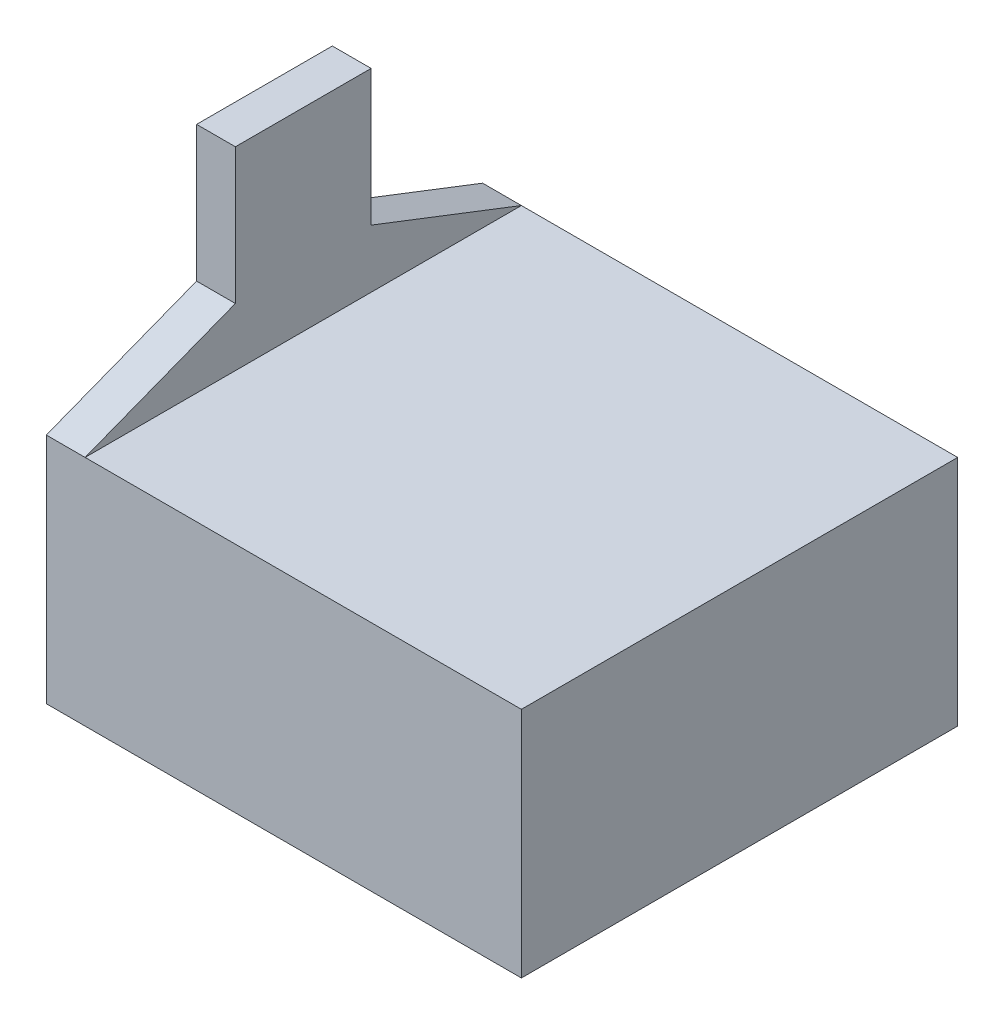
ISO-10303-21;
HEADER;
FILE_DESCRIPTION(('STEP AP214'),'2;1');
FILE_NAME('part.step','',(''),(''),'','','');
FILE_SCHEMA(('AUTOMOTIVE_DESIGN { 1 0 10303 214 1 1 1 1 }'));
ENDSEC;
DATA;
#1=APPLICATION_CONTEXT('core data for automotive mechanical design processes');
#2=APPLICATION_PROTOCOL_DEFINITION('international standard','automotive_design',2000,#1);
#3=PRODUCT_CONTEXT('',#1,'mechanical');
#4=PRODUCT('Part','Part','',(#3));
#5=PRODUCT_RELATED_PRODUCT_CATEGORY('part','',(#4));
#6=PRODUCT_DEFINITION_FORMATION('','',#4);
#7=PRODUCT_DEFINITION_CONTEXT('part definition',#1,'design');
#8=PRODUCT_DEFINITION('design','',#6,#7);
#9=PRODUCT_DEFINITION_SHAPE('','',#8);
#10=(LENGTH_UNIT() NAMED_UNIT(*) SI_UNIT(.MILLI.,.METRE.));
#11=(NAMED_UNIT(*) PLANE_ANGLE_UNIT() SI_UNIT($,.RADIAN.));
#12=(NAMED_UNIT(*) SI_UNIT($,.STERADIAN.) SOLID_ANGLE_UNIT());
#13=UNCERTAINTY_MEASURE_WITH_UNIT(LENGTH_MEASURE(1.E-05),#10,'distance_accuracy_value','');
#14=(GEOMETRIC_REPRESENTATION_CONTEXT(3) GLOBAL_UNCERTAINTY_ASSIGNED_CONTEXT((#13)) GLOBAL_UNIT_ASSIGNED_CONTEXT((#10,
#11,#12)) REPRESENTATION_CONTEXT('',''));
#15=CARTESIAN_POINT('',(0.,0.,0.));
#16=DIRECTION('',(0.,0.,1.));
#17=DIRECTION('',(1.,0.,0.));
#18=AXIS2_PLACEMENT_3D('',#15,#16,#17);
#19=CARTESIAN_POINT('',(2.,0.,0.));
#20=DIRECTION('',(1.,0.,0.));
#21=DIRECTION('',(0.,0.,-1.));
#22=AXIS2_PLACEMENT_3D('',#19,#20,#21);
#23=PLANE('',#22);
#24=DIRECTION('',(0.,-0.360994102557712,0.93256809827409));
#25=VECTOR('',#24,1.);
#26=CARTESIAN_POINT('',(2.,15.,3.5));
#27=LINE('',#26,#25);
#28=CARTESIAN_POINT('',(2.,15.,3.5));
#29=VERTEX_POINT('',#28);
#30=CARTESIAN_POINT('',(2.,12.,11.25));
#31=VERTEX_POINT('',#30);
#32=EDGE_CURVE('E127',#29,#31,#27,.T.);
#33=ORIENTED_EDGE('',*,*,#32,.T.);
#34=DIRECTION('',(0.,0.,-1.));
#35=VECTOR('',#34,1.);
#36=CARTESIAN_POINT('',(2.,12.,11.25));
#37=LINE('',#36,#35);
#38=CARTESIAN_POINT('',(2.,12.,-11.25));
#39=VERTEX_POINT('',#38);
#40=EDGE_CURVE('E186',#31,#39,#37,.T.);
#41=ORIENTED_EDGE('',*,*,#40,.T.);
#42=DIRECTION('',(0.,0.360994102557712,0.93256809827409));
#43=VECTOR('',#42,1.);
#44=CARTESIAN_POINT('',(2.,12.,-11.25));
#45=LINE('',#44,#43);
#46=CARTESIAN_POINT('',(2.,15.,-3.5));
#47=VERTEX_POINT('',#46);
#48=EDGE_CURVE('E110',#39,#47,#45,.T.);
#49=ORIENTED_EDGE('',*,*,#48,.T.);
#50=DIRECTION('',(0.,1.,0.));
#51=VECTOR('',#50,1.);
#52=CARTESIAN_POINT('',(2.,15.,-3.5));
#53=LINE('',#52,#51);
#54=CARTESIAN_POINT('',(2.,22.,-3.5));
#55=VERTEX_POINT('',#54);
#56=EDGE_CURVE('E104',#47,#55,#53,.T.);
#57=ORIENTED_EDGE('',*,*,#56,.T.);
#58=DIRECTION('',(0.,0.,1.));
#59=VECTOR('',#58,1.);
#60=CARTESIAN_POINT('',(2.,22.,-3.5));
#61=LINE('',#60,#59);
#62=CARTESIAN_POINT('',(2.,22.,3.5));
#63=VERTEX_POINT('',#62);
#64=EDGE_CURVE('E107',#55,#63,#61,.T.);
#65=ORIENTED_EDGE('',*,*,#64,.T.);
#66=DIRECTION('',(0.,-1.,0.));
#67=VECTOR('',#66,1.);
#68=CARTESIAN_POINT('',(2.,22.,3.5));
#69=LINE('',#68,#67);
#70=EDGE_CURVE('E50',#63,#29,#69,.T.);
#71=ORIENTED_EDGE('',*,*,#70,.T.);
#72=EDGE_LOOP('',(#33,#41,#49,#57,#65,#71));
#73=FACE_BOUND('',#72,.T.);
#74=ADVANCED_FACE('F33',(#73),#23,.T.);
#75=CARTESIAN_POINT('',(2.,12.,11.25));
#76=DIRECTION('',(0.,0.,-1.));
#77=DIRECTION('',(0.,1.,0.));
#78=AXIS2_PLACEMENT_3D('',#75,#76,#77);
#79=PLANE('',#78);
#80=DIRECTION('',(0.,-1.,0.));
#81=VECTOR('',#80,1.);
#82=CARTESIAN_POINT('',(0.,12.,11.25));
#83=LINE('',#82,#81);
#84=CARTESIAN_POINT('',(0.,12.,11.25));
#85=VERTEX_POINT('',#84);
#86=CARTESIAN_POINT('',(0.,0.,11.25));
#87=VERTEX_POINT('',#86);
#88=EDGE_CURVE('E133',#85,#87,#83,.T.);
#89=ORIENTED_EDGE('',*,*,#88,.T.);
#90=DIRECTION('',(-1.,0.,0.));
#91=VECTOR('',#90,1.);
#92=CARTESIAN_POINT('',(2.,0.,11.25));
#93=LINE('',#92,#91);
#94=CARTESIAN_POINT('',(24.5,0.,11.25));
#95=VERTEX_POINT('',#94);
#96=EDGE_CURVE('E11',#95,#87,#93,.T.);
#97=ORIENTED_EDGE('',*,*,#96,.F.);
#98=DIRECTION('',(0.,1.,0.));
#99=VECTOR('',#98,1.);
#100=CARTESIAN_POINT('',(24.5,0.,11.25));
#101=LINE('',#100,#99);
#102=CARTESIAN_POINT('',(24.5,12.,11.25));
#103=VERTEX_POINT('',#102);
#104=EDGE_CURVE('E176',#95,#103,#101,.T.);
#105=ORIENTED_EDGE('',*,*,#104,.T.);
#106=DIRECTION('',(-1.,0.,0.));
#107=VECTOR('',#106,1.);
#108=CARTESIAN_POINT('',(24.5,12.,11.25));
#109=LINE('',#108,#107);
#110=EDGE_CURVE('E137',#103,#31,#109,.T.);
#111=ORIENTED_EDGE('',*,*,#110,.T.);
#112=DIRECTION('',(-1.,0.,0.));
#113=VECTOR('',#112,1.);
#114=CARTESIAN_POINT('',(2.,12.,11.25));
#115=LINE('',#114,#113);
#116=EDGE_CURVE('E132',#31,#85,#115,.T.);
#117=ORIENTED_EDGE('',*,*,#116,.T.);
#118=EDGE_LOOP('',(#89,#97,#105,#111,#117));
#119=FACE_BOUND('',#118,.T.);
#120=ADVANCED_FACE('F35',(#119),#79,.F.);
#121=CARTESIAN_POINT('',(2.,0.,11.25));
#122=DIRECTION('',(0.,1.,0.));
#123=DIRECTION('',(0.,0.,1.));
#124=AXIS2_PLACEMENT_3D('',#121,#122,#123);
#125=PLANE('',#124);
#126=DIRECTION('',(0.,0.,-1.));
#127=VECTOR('',#126,1.);
#128=CARTESIAN_POINT('',(0.,0.,11.25));
#129=LINE('',#128,#127);
#130=CARTESIAN_POINT('',(0.,0.,-11.25));
#131=VERTEX_POINT('',#130);
#132=EDGE_CURVE('E136',#87,#131,#129,.T.);
#133=ORIENTED_EDGE('',*,*,#132,.T.);
#134=DIRECTION('',(-1.,0.,0.));
#135=VECTOR('',#134,1.);
#136=CARTESIAN_POINT('',(2.,0.,-11.25));
#137=LINE('',#136,#135);
#138=CARTESIAN_POINT('',(24.5,0.,-11.25));
#139=VERTEX_POINT('',#138);
#140=EDGE_CURVE('E42',#139,#131,#137,.T.);
#141=ORIENTED_EDGE('',*,*,#140,.F.);
#142=DIRECTION('',(0.,0.,-1.));
#143=VECTOR('',#142,1.);
#144=CARTESIAN_POINT('',(24.5,0.,11.25));
#145=LINE('',#144,#143);
#146=EDGE_CURVE('E188',#95,#139,#145,.T.);
#147=ORIENTED_EDGE('',*,*,#146,.F.);
#148=ORIENTED_EDGE('',*,*,#96,.T.);
#149=EDGE_LOOP('',(#133,#141,#147,#148));
#150=FACE_BOUND('',#149,.T.);
#151=ADVANCED_FACE('F212',(#150),#125,.F.);
#152=CARTESIAN_POINT('',(2.,0.,-11.25));
#153=DIRECTION('',(0.,0.,1.));
#154=DIRECTION('',(0.,-1.,0.));
#155=AXIS2_PLACEMENT_3D('',#152,#153,#154);
#156=PLANE('',#155);
#157=DIRECTION('',(0.,1.,0.));
#158=VECTOR('',#157,1.);
#159=CARTESIAN_POINT('',(0.,0.,-11.25));
#160=LINE('',#159,#158);
#161=CARTESIAN_POINT('',(0.,12.,-11.25));
#162=VERTEX_POINT('',#161);
#163=EDGE_CURVE('E139',#131,#162,#160,.T.);
#164=ORIENTED_EDGE('',*,*,#163,.T.);
#165=DIRECTION('',(-1.,0.,0.));
#166=VECTOR('',#165,1.);
#167=CARTESIAN_POINT('',(2.,12.,-11.25));
#168=LINE('',#167,#166);
#169=EDGE_CURVE('E153',#39,#162,#168,.T.);
#170=ORIENTED_EDGE('',*,*,#169,.F.);
#171=DIRECTION('',(-1.,0.,0.));
#172=VECTOR('',#171,1.);
#173=CARTESIAN_POINT('',(24.5,12.,-11.25));
#174=LINE('',#173,#172);
#175=CARTESIAN_POINT('',(24.5,12.,-11.25));
#176=VERTEX_POINT('',#175);
#177=EDGE_CURVE('E95',#176,#39,#174,.T.);
#178=ORIENTED_EDGE('',*,*,#177,.F.);
#179=DIRECTION('',(0.,1.,0.));
#180=VECTOR('',#179,1.);
#181=CARTESIAN_POINT('',(24.5,0.,-11.25));
#182=LINE('',#181,#180);
#183=EDGE_CURVE('E164',#139,#176,#182,.T.);
#184=ORIENTED_EDGE('',*,*,#183,.F.);
#185=ORIENTED_EDGE('',*,*,#140,.T.);
#186=EDGE_LOOP('',(#164,#170,#178,#184,#185));
#187=FACE_BOUND('',#186,.T.);
#188=ADVANCED_FACE('F160',(#187),#156,.F.);
#189=CARTESIAN_POINT('',(2.,12.,-11.25));
#190=DIRECTION('',(0.,-0.93256809827409,0.360994102557712));
#191=DIRECTION('',(0.,-0.360994102557712,-0.93256809827409));
#192=AXIS2_PLACEMENT_3D('',#189,#190,#191);
#193=PLANE('',#192);
#194=DIRECTION('',(0.,0.360994102557712,0.93256809827409));
#195=VECTOR('',#194,1.);
#196=CARTESIAN_POINT('',(0.,12.,-11.25));
#197=LINE('',#196,#195);
#198=CARTESIAN_POINT('',(0.,15.,-3.5));
#199=VERTEX_POINT('',#198);
#200=EDGE_CURVE('E141',#162,#199,#197,.T.);
#201=ORIENTED_EDGE('',*,*,#200,.T.);
#202=DIRECTION('',(-1.,0.,0.));
#203=VECTOR('',#202,1.);
#204=CARTESIAN_POINT('',(2.,15.,-3.5));
#205=LINE('',#204,#203);
#206=EDGE_CURVE('E122',#47,#199,#205,.T.);
#207=ORIENTED_EDGE('',*,*,#206,.F.);
#208=ORIENTED_EDGE('',*,*,#48,.F.);
#209=ORIENTED_EDGE('',*,*,#169,.T.);
#210=EDGE_LOOP('',(#201,#207,#208,#209));
#211=FACE_BOUND('',#210,.T.);
#212=ADVANCED_FACE('F173',(#211),#193,.F.);
#213=CARTESIAN_POINT('',(2.,15.,-3.5));
#214=DIRECTION('',(0.,0.,1.));
#215=DIRECTION('',(0.,-1.,0.));
#216=AXIS2_PLACEMENT_3D('',#213,#214,#215);
#217=PLANE('',#216);
#218=DIRECTION('',(0.,1.,0.));
#219=VECTOR('',#218,1.);
#220=CARTESIAN_POINT('',(0.,15.,-3.5));
#221=LINE('',#220,#219);
#222=CARTESIAN_POINT('',(0.,22.,-3.5));
#223=VERTEX_POINT('',#222);
#224=EDGE_CURVE('E119',#199,#223,#221,.T.);
#225=ORIENTED_EDGE('',*,*,#224,.T.);
#226=DIRECTION('',(-1.,0.,0.));
#227=VECTOR('',#226,1.);
#228=CARTESIAN_POINT('',(2.,22.,-3.5));
#229=LINE('',#228,#227);
#230=EDGE_CURVE('E116',#55,#223,#229,.T.);
#231=ORIENTED_EDGE('',*,*,#230,.F.);
#232=ORIENTED_EDGE('',*,*,#56,.F.);
#233=ORIENTED_EDGE('',*,*,#206,.T.);
#234=EDGE_LOOP('',(#225,#231,#232,#233));
#235=FACE_BOUND('',#234,.T.);
#236=ADVANCED_FACE('F117',(#235),#217,.F.);
#237=CARTESIAN_POINT('',(2.,22.,-3.5));
#238=DIRECTION('',(0.,-1.,0.));
#239=DIRECTION('',(0.,0.,-1.));
#240=AXIS2_PLACEMENT_3D('',#237,#238,#239);
#241=PLANE('',#240);
#242=DIRECTION('',(0.,0.,1.));
#243=VECTOR('',#242,1.);
#244=CARTESIAN_POINT('',(0.,22.,-3.5));
#245=LINE('',#244,#243);
#246=CARTESIAN_POINT('',(0.,22.,3.5));
#247=VERTEX_POINT('',#246);
#248=EDGE_CURVE('E144',#223,#247,#245,.T.);
#249=ORIENTED_EDGE('',*,*,#248,.T.);
#250=DIRECTION('',(-1.,0.,0.));
#251=VECTOR('',#250,1.);
#252=CARTESIAN_POINT('',(2.,22.,3.5));
#253=LINE('',#252,#251);
#254=EDGE_CURVE('E123',#63,#247,#253,.T.);
#255=ORIENTED_EDGE('',*,*,#254,.F.);
#256=ORIENTED_EDGE('',*,*,#64,.F.);
#257=ORIENTED_EDGE('',*,*,#230,.T.);
#258=EDGE_LOOP('',(#249,#255,#256,#257));
#259=FACE_BOUND('',#258,.T.);
#260=ADVANCED_FACE('F125',(#259),#241,.F.);
#261=CARTESIAN_POINT('',(2.,22.,3.5));
#262=DIRECTION('',(0.,0.,-1.));
#263=DIRECTION('',(-1.,0.,0.));
#264=AXIS2_PLACEMENT_3D('',#261,#262,#263);
#265=PLANE('',#264);
#266=DIRECTION('',(0.,-1.,0.));
#267=VECTOR('',#266,1.);
#268=CARTESIAN_POINT('',(0.,22.,3.5));
#269=LINE('',#268,#267);
#270=CARTESIAN_POINT('',(0.,15.,3.5));
#271=VERTEX_POINT('',#270);
#272=EDGE_CURVE('E79',#247,#271,#269,.T.);
#273=ORIENTED_EDGE('',*,*,#272,.T.);
#274=DIRECTION('',(-1.,0.,0.));
#275=VECTOR('',#274,1.);
#276=CARTESIAN_POINT('',(2.,15.,3.5));
#277=LINE('',#276,#275);
#278=EDGE_CURVE('E149',#29,#271,#277,.T.);
#279=ORIENTED_EDGE('',*,*,#278,.F.);
#280=ORIENTED_EDGE('',*,*,#70,.F.);
#281=ORIENTED_EDGE('',*,*,#254,.T.);
#282=EDGE_LOOP('',(#273,#279,#280,#281));
#283=FACE_BOUND('',#282,.T.);
#284=ADVANCED_FACE('F199',(#283),#265,.F.);
#285=CARTESIAN_POINT('',(2.,15.,3.5));
#286=DIRECTION('',(0.,-0.93256809827409,-0.360994102557712));
#287=DIRECTION('',(0.,0.360994102557712,-0.93256809827409));
#288=AXIS2_PLACEMENT_3D('',#285,#286,#287);
#289=PLANE('',#288);
#290=DIRECTION('',(0.,-0.360994102557712,0.93256809827409));
#291=VECTOR('',#290,1.);
#292=CARTESIAN_POINT('',(0.,15.,3.5));
#293=LINE('',#292,#291);
#294=EDGE_CURVE('E86',#271,#85,#293,.T.);
#295=ORIENTED_EDGE('',*,*,#294,.T.);
#296=ORIENTED_EDGE('',*,*,#116,.F.);
#297=ORIENTED_EDGE('',*,*,#32,.F.);
#298=ORIENTED_EDGE('',*,*,#278,.T.);
#299=EDGE_LOOP('',(#295,#296,#297,#298));
#300=FACE_BOUND('',#299,.T.);
#301=ADVANCED_FACE('F197',(#300),#289,.F.);
#302=CARTESIAN_POINT('',(0.,0.,0.));
#303=DIRECTION('',(1.,0.,0.));
#304=DIRECTION('',(0.,0.,-1.));
#305=AXIS2_PLACEMENT_3D('',#302,#303,#304);
#306=PLANE('',#305);
#307=ORIENTED_EDGE('',*,*,#88,.F.);
#308=ORIENTED_EDGE('',*,*,#294,.F.);
#309=ORIENTED_EDGE('',*,*,#272,.F.);
#310=ORIENTED_EDGE('',*,*,#248,.F.);
#311=ORIENTED_EDGE('',*,*,#224,.F.);
#312=ORIENTED_EDGE('',*,*,#200,.F.);
#313=ORIENTED_EDGE('',*,*,#163,.F.);
#314=ORIENTED_EDGE('',*,*,#132,.F.);
#315=EDGE_LOOP('',(#307,#308,#309,#310,#311,#312,#313,#314));
#316=FACE_BOUND('',#315,.T.);
#317=ADVANCED_FACE('F171',(#316),#306,.F.);
#318=CARTESIAN_POINT('',(24.5,12.,11.25));
#319=DIRECTION('',(0.,1.,0.));
#320=DIRECTION('',(0.,0.,1.));
#321=AXIS2_PLACEMENT_3D('',#318,#319,#320);
#322=PLANE('',#321);
#323=ORIENTED_EDGE('',*,*,#40,.F.);
#324=ORIENTED_EDGE('',*,*,#110,.F.);
#325=DIRECTION('',(0.,0.,-1.));
#326=VECTOR('',#325,1.);
#327=CARTESIAN_POINT('',(24.5,12.,11.25));
#328=LINE('',#327,#326);
#329=EDGE_CURVE('E180',#103,#176,#328,.T.);
#330=ORIENTED_EDGE('',*,*,#329,.T.);
#331=ORIENTED_EDGE('',*,*,#177,.T.);
#332=EDGE_LOOP('',(#323,#324,#330,#331));
#333=FACE_BOUND('',#332,.T.);
#334=ADVANCED_FACE('F181',(#333),#322,.T.);
#335=CARTESIAN_POINT('',(24.5,0.,0.));
#336=DIRECTION('',(1.,0.,0.));
#337=DIRECTION('',(0.,0.,-1.));
#338=AXIS2_PLACEMENT_3D('',#335,#336,#337);
#339=PLANE('',#338);
#340=ORIENTED_EDGE('',*,*,#329,.F.);
#341=ORIENTED_EDGE('',*,*,#104,.F.);
#342=ORIENTED_EDGE('',*,*,#146,.T.);
#343=ORIENTED_EDGE('',*,*,#183,.T.);
#344=EDGE_LOOP('',(#340,#341,#342,#343));
#345=FACE_BOUND('',#344,.T.);
#346=ADVANCED_FACE('F216',(#345),#339,.T.);
#347=CLOSED_SHELL('',(#74,#120,#151,#188,#212,#236,#260,#284,#301,#317,#334,#346));
#348=MANIFOLD_SOLID_BREP('B2',#347);
#349=ADVANCED_BREP_SHAPE_REPRESENTATION('',(#18,#348),#14);
#350=SHAPE_DEFINITION_REPRESENTATION(#9,#349);
ENDSEC;
END-ISO-10303-21;
